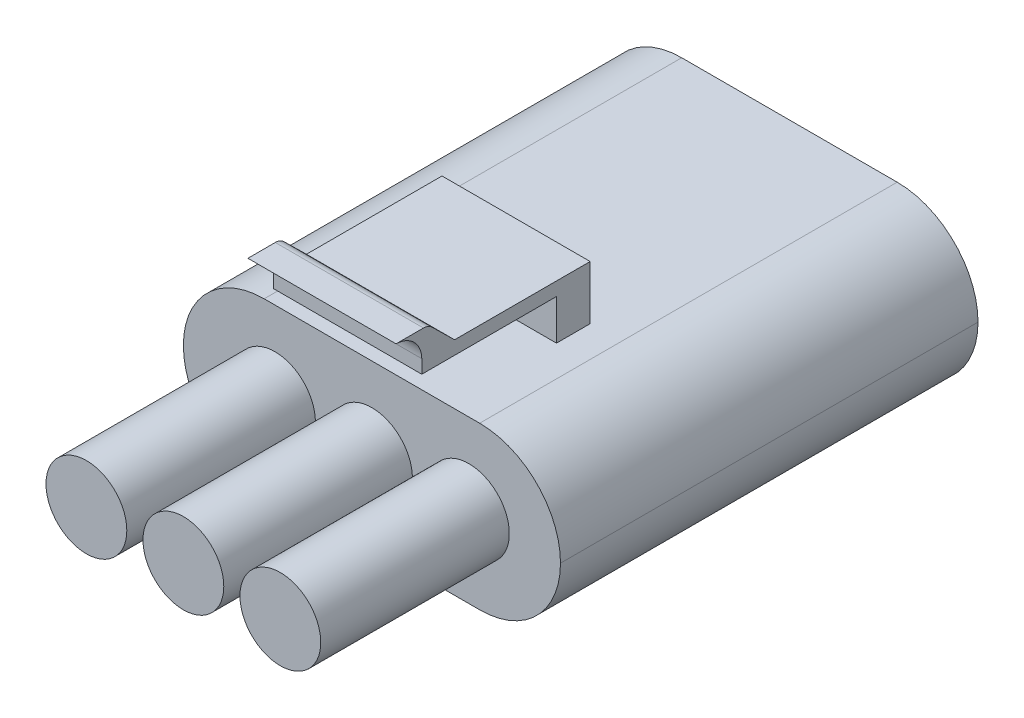
ISO-10303-21;
HEADER;
FILE_DESCRIPTION(('STEP AP214'),'2;1');
FILE_NAME('part.step','',(''),(''),'','','');
FILE_SCHEMA(('AUTOMOTIVE_DESIGN { 1 0 10303 214 1 1 1 1 }'));
ENDSEC;
DATA;
#1=APPLICATION_CONTEXT('core data for automotive mechanical design processes');
#2=APPLICATION_PROTOCOL_DEFINITION('international standard','automotive_design',2000,#1);
#3=PRODUCT_CONTEXT('',#1,'mechanical');
#4=PRODUCT('Part','Part','',(#3));
#5=PRODUCT_RELATED_PRODUCT_CATEGORY('part','',(#4));
#6=PRODUCT_DEFINITION_FORMATION('','',#4);
#7=PRODUCT_DEFINITION_CONTEXT('part definition',#1,'design');
#8=PRODUCT_DEFINITION('design','',#6,#7);
#9=PRODUCT_DEFINITION_SHAPE('','',#8);
#10=(LENGTH_UNIT() NAMED_UNIT(*) SI_UNIT(.MILLI.,.METRE.));
#11=(NAMED_UNIT(*) PLANE_ANGLE_UNIT() SI_UNIT($,.RADIAN.));
#12=(NAMED_UNIT(*) SI_UNIT($,.STERADIAN.) SOLID_ANGLE_UNIT());
#13=UNCERTAINTY_MEASURE_WITH_UNIT(LENGTH_MEASURE(1.E-05),#10,'distance_accuracy_value','');
#14=(GEOMETRIC_REPRESENTATION_CONTEXT(3) GLOBAL_UNCERTAINTY_ASSIGNED_CONTEXT((#13)) GLOBAL_UNIT_ASSIGNED_CONTEXT((#10,
#11,#12)) REPRESENTATION_CONTEXT('',''));
#15=CARTESIAN_POINT('',(0.,0.,0.));
#16=DIRECTION('',(0.,0.,1.));
#17=DIRECTION('',(1.,0.,0.));
#18=AXIS2_PLACEMENT_3D('',#15,#16,#17);
#19=CARTESIAN_POINT('',(0.,16.,0.));
#20=DIRECTION('',(0.,1.,0.));
#21=DIRECTION('',(0.,0.,1.));
#22=AXIS2_PLACEMENT_3D('',#19,#20,#21);
#23=PLANE('',#22);
#24=DIRECTION('',(0.,0.,1.));
#25=VECTOR('',#24,1.);
#26=CARTESIAN_POINT('',(8.70256652162755,16.,20.5));
#27=LINE('',#26,#25);
#28=CARTESIAN_POINT('',(8.70256652162755,16.,20.5));
#29=VERTEX_POINT('',#28);
#30=CARTESIAN_POINT('',(8.70256652162755,16.,30.5660328926047));
#31=VERTEX_POINT('',#30);
#32=EDGE_CURVE('E208',#29,#31,#27,.T.);
#33=ORIENTED_EDGE('',*,*,#32,.T.);
#34=DIRECTION('',(1.,0.,0.));
#35=VECTOR('',#34,1.);
#36=CARTESIAN_POINT('',(8.70256652162755,16.,30.5660328926047));
#37=LINE('',#36,#35);
#38=CARTESIAN_POINT('',(19.7025665216275,16.,30.5660328926047));
#39=VERTEX_POINT('',#38);
#40=EDGE_CURVE('E195',#31,#39,#37,.T.);
#41=ORIENTED_EDGE('',*,*,#40,.T.);
#42=DIRECTION('',(0.,0.,-1.));
#43=VECTOR('',#42,1.);
#44=CARTESIAN_POINT('',(19.7025665216275,16.,20.5));
#45=LINE('',#44,#43);
#46=CARTESIAN_POINT('',(19.7025665216275,16.,20.5));
#47=VERTEX_POINT('',#46);
#48=EDGE_CURVE('E200',#39,#47,#45,.T.);
#49=ORIENTED_EDGE('',*,*,#48,.T.);
#50=DIRECTION('',(-1.,0.,0.));
#51=VECTOR('',#50,1.);
#52=CARTESIAN_POINT('',(8.70256652162755,16.,20.5));
#53=LINE('',#52,#51);
#54=EDGE_CURVE('E213',#47,#29,#53,.T.);
#55=ORIENTED_EDGE('',*,*,#54,.T.);
#56=EDGE_LOOP('',(#33,#41,#49,#55));
#57=FACE_BOUND('',#56,.T.);
#58=ADVANCED_FACE('F36',(#57),#23,.T.);
#59=CARTESIAN_POINT('',(8.70256652162755,16.,23.));
#60=DIRECTION('',(0.,0.,-1.));
#61=DIRECTION('',(-1.,0.,0.));
#62=AXIS2_PLACEMENT_3D('',#59,#60,#61);
#63=PLANE('',#62);
#64=DIRECTION('',(1.,0.,0.));
#65=VECTOR('',#64,1.);
#66=CARTESIAN_POINT('',(8.70256652162755,15.,23.));
#67=LINE('',#66,#65);
#68=CARTESIAN_POINT('',(8.70256652162755,15.,23.));
#69=VERTEX_POINT('',#68);
#70=CARTESIAN_POINT('',(19.7025665216275,15.,23.));
#71=VERTEX_POINT('',#70);
#72=EDGE_CURVE('E194',#69,#71,#67,.T.);
#73=ORIENTED_EDGE('',*,*,#72,.F.);
#74=DIRECTION('',(0.,-1.,0.));
#75=VECTOR('',#74,1.);
#76=CARTESIAN_POINT('',(8.70256652162755,16.,23.));
#77=LINE('',#76,#75);
#78=CARTESIAN_POINT('',(8.70256652162755,12.,23.));
#79=VERTEX_POINT('',#78);
#80=EDGE_CURVE('E61',#69,#79,#77,.T.);
#81=ORIENTED_EDGE('',*,*,#80,.T.);
#82=DIRECTION('',(1.,0.,0.));
#83=VECTOR('',#82,1.);
#84=CARTESIAN_POINT('',(8.70256652162755,12.,23.));
#85=LINE('',#84,#83);
#86=CARTESIAN_POINT('',(19.7025665216275,12.,23.));
#87=VERTEX_POINT('',#86);
#88=EDGE_CURVE('E231',#79,#87,#85,.T.);
#89=ORIENTED_EDGE('',*,*,#88,.T.);
#90=DIRECTION('',(0.,-1.,0.));
#91=VECTOR('',#90,1.);
#92=CARTESIAN_POINT('',(19.7025665216275,16.,23.));
#93=LINE('',#92,#91);
#94=EDGE_CURVE('E239',#71,#87,#93,.T.);
#95=ORIENTED_EDGE('',*,*,#94,.F.);
#96=EDGE_LOOP('',(#73,#81,#89,#95));
#97=FACE_BOUND('',#96,.T.);
#98=ADVANCED_FACE('F348',(#97),#63,.F.);
#99=CARTESIAN_POINT('',(0.,12.,31.));
#100=DIRECTION('',(0.,-1.,0.));
#101=DIRECTION('',(0.,0.,-1.));
#102=AXIS2_PLACEMENT_3D('',#99,#100,#101);
#103=PLANE('',#102);
#104=DIRECTION('',(-1.,0.,0.));
#105=VECTOR('',#104,1.);
#106=CARTESIAN_POINT('',(0.,12.,31.));
#107=LINE('',#106,#105);
#108=CARTESIAN_POINT('',(22.,12.,31.));
#109=VERTEX_POINT('',#108);
#110=CARTESIAN_POINT('',(6.,12.,31.));
#111=VERTEX_POINT('',#110);
#112=EDGE_CURVE('E255',#109,#111,#107,.T.);
#113=ORIENTED_EDGE('',*,*,#112,.F.);
#114=DIRECTION('',(0.,0.,-1.));
#115=VECTOR('',#114,1.);
#116=CARTESIAN_POINT('',(22.,12.,31.));
#117=LINE('',#116,#115);
#118=CARTESIAN_POINT('',(22.,12.,0.));
#119=VERTEX_POINT('',#118);
#120=EDGE_CURVE('E289',#109,#119,#117,.T.);
#121=ORIENTED_EDGE('',*,*,#120,.T.);
#122=DIRECTION('',(-1.,0.,0.));
#123=VECTOR('',#122,1.);
#124=CARTESIAN_POINT('',(0.,12.,0.));
#125=LINE('',#124,#123);
#126=CARTESIAN_POINT('',(6.,12.,0.));
#127=VERTEX_POINT('',#126);
#128=EDGE_CURVE('E256',#119,#127,#125,.T.);
#129=ORIENTED_EDGE('',*,*,#128,.T.);
#130=DIRECTION('',(0.,0.,-1.));
#131=VECTOR('',#130,1.);
#132=CARTESIAN_POINT('',(6.,12.,31.));
#133=LINE('',#132,#131);
#134=EDGE_CURVE('E287',#127,#111,#133,.F.);
#135=ORIENTED_EDGE('',*,*,#134,.T.);
#136=EDGE_LOOP('',(#113,#121,#129,#135));
#137=FACE_BOUND('',#136,.T.);
#138=DIRECTION('',(0.,0.,1.));
#139=VECTOR('',#138,1.);
#140=CARTESIAN_POINT('',(8.70256652162755,12.,20.5));
#141=LINE('',#140,#139);
#142=CARTESIAN_POINT('',(8.70256652162755,12.,20.5));
#143=VERTEX_POINT('',#142);
#144=EDGE_CURVE('E229',#143,#79,#141,.T.);
#145=ORIENTED_EDGE('',*,*,#144,.F.);
#146=DIRECTION('',(-1.,0.,0.));
#147=VECTOR('',#146,1.);
#148=CARTESIAN_POINT('',(8.70256652162755,12.,20.5));
#149=LINE('',#148,#147);
#150=CARTESIAN_POINT('',(19.7025665216275,12.,20.5));
#151=VERTEX_POINT('',#150);
#152=EDGE_CURVE('E215',#151,#143,#149,.T.);
#153=ORIENTED_EDGE('',*,*,#152,.F.);
#154=DIRECTION('',(0.,0.,-1.));
#155=VECTOR('',#154,1.);
#156=CARTESIAN_POINT('',(19.7025665216275,12.,20.5));
#157=LINE('',#156,#155);
#158=EDGE_CURVE('E217',#87,#151,#157,.T.);
#159=ORIENTED_EDGE('',*,*,#158,.F.);
#160=ORIENTED_EDGE('',*,*,#88,.F.);
#161=EDGE_LOOP('',(#145,#153,#159,#160));
#162=FACE_BOUND('',#161,.T.);
#163=ADVANCED_FACE('F329',(#137,#162),#103,.F.);
#164=CARTESIAN_POINT('',(0.,0.,31.));
#165=DIRECTION('',(0.,1.,0.));
#166=DIRECTION('',(0.,0.,1.));
#167=AXIS2_PLACEMENT_3D('',#164,#165,#166);
#168=PLANE('',#167);
#169=DIRECTION('',(1.,0.,0.));
#170=VECTOR('',#169,1.);
#171=CARTESIAN_POINT('',(0.,0.,0.));
#172=LINE('',#171,#170);
#173=CARTESIAN_POINT('',(6.,0.,0.));
#174=VERTEX_POINT('',#173);
#175=CARTESIAN_POINT('',(22.,0.,0.));
#176=VERTEX_POINT('',#175);
#177=EDGE_CURVE('E260',#174,#176,#172,.T.);
#178=ORIENTED_EDGE('',*,*,#177,.T.);
#179=DIRECTION('',(0.,0.,-1.));
#180=VECTOR('',#179,1.);
#181=CARTESIAN_POINT('',(22.,0.,31.));
#182=LINE('',#181,#180);
#183=CARTESIAN_POINT('',(22.,0.,31.));
#184=VERTEX_POINT('',#183);
#185=EDGE_CURVE('E276',#176,#184,#182,.F.);
#186=ORIENTED_EDGE('',*,*,#185,.T.);
#187=DIRECTION('',(1.,0.,0.));
#188=VECTOR('',#187,1.);
#189=CARTESIAN_POINT('',(0.,0.,31.));
#190=LINE('',#189,#188);
#191=CARTESIAN_POINT('',(6.,0.,31.));
#192=VERTEX_POINT('',#191);
#193=EDGE_CURVE('E252',#192,#184,#190,.T.);
#194=ORIENTED_EDGE('',*,*,#193,.F.);
#195=DIRECTION('',(0.,0.,-1.));
#196=VECTOR('',#195,1.);
#197=CARTESIAN_POINT('',(6.,0.,31.));
#198=LINE('',#197,#196);
#199=EDGE_CURVE('E273',#192,#174,#198,.T.);
#200=ORIENTED_EDGE('',*,*,#199,.T.);
#201=EDGE_LOOP('',(#178,#186,#194,#200));
#202=FACE_BOUND('',#201,.T.);
#203=ADVANCED_FACE('F306',(#202),#168,.F.);
#204=CARTESIAN_POINT('',(0.,0.,31.));
#205=DIRECTION('',(0.,0.,-1.));
#206=DIRECTION('',(-1.,0.,0.));
#207=AXIS2_PLACEMENT_3D('',#204,#205,#206);
#208=PLANE('',#207);
#209=CARTESIAN_POINT('',(21.2005758644492,6.,31.));
#210=DIRECTION('',(0.,0.,-1.));
#211=DIRECTION('',(-1.,0.,0.));
#212=AXIS2_PLACEMENT_3D('',#209,#210,#211);
#213=CIRCLE('',#212,3.);
#214=CARTESIAN_POINT('',(18.2005758644492,6.,31.));
#215=VERTEX_POINT('',#214);
#216=EDGE_CURVE('E11',#215,#215,#213,.F.);
#217=ORIENTED_EDGE('',*,*,#216,.F.);
#218=EDGE_LOOP('',(#217));
#219=FACE_BOUND('',#218,.T.);
#220=CARTESIAN_POINT('',(6.79942413555083,6.,31.));
#221=DIRECTION('',(0.,0.,-1.));
#222=DIRECTION('',(-1.,0.,0.));
#223=AXIS2_PLACEMENT_3D('',#220,#221,#222);
#224=CIRCLE('',#223,3.);
#225=CARTESIAN_POINT('',(3.79942413555083,6.,31.));
#226=VERTEX_POINT('',#225);
#227=EDGE_CURVE('E45',#226,#226,#224,.F.);
#228=ORIENTED_EDGE('',*,*,#227,.F.);
#229=EDGE_LOOP('',(#228));
#230=FACE_BOUND('',#229,.T.);
#231=CARTESIAN_POINT('',(14.,6.,31.));
#232=DIRECTION('',(0.,0.,-1.));
#233=DIRECTION('',(-1.,0.,0.));
#234=AXIS2_PLACEMENT_3D('',#231,#232,#233);
#235=CIRCLE('',#234,3.);
#236=CARTESIAN_POINT('',(11.,6.,31.));
#237=VERTEX_POINT('',#236);
#238=EDGE_CURVE('E291',#237,#237,#235,.F.);
#239=ORIENTED_EDGE('',*,*,#238,.F.);
#240=EDGE_LOOP('',(#239));
#241=FACE_BOUND('',#240,.T.);
#242=ORIENTED_EDGE('',*,*,#193,.T.);
#243=CARTESIAN_POINT('',(22.,6.,31.));
#244=DIRECTION('',(0.,0.,-1.));
#245=DIRECTION('',(-1.,0.,0.));
#246=AXIS2_PLACEMENT_3D('',#243,#244,#245);
#247=CIRCLE('',#246,6.);
#248=CARTESIAN_POINT('',(28.,6.,31.));
#249=VERTEX_POINT('',#248);
#250=EDGE_CURVE('E285',#184,#249,#247,.F.);
#251=ORIENTED_EDGE('',*,*,#250,.T.);
#252=CARTESIAN_POINT('',(22.,6.,31.));
#253=DIRECTION('',(0.,0.,-1.));
#254=DIRECTION('',(-1.,0.,0.));
#255=AXIS2_PLACEMENT_3D('',#252,#253,#254);
#256=CIRCLE('',#255,6.);
#257=EDGE_CURVE('E283',#249,#109,#256,.F.);
#258=ORIENTED_EDGE('',*,*,#257,.T.);
#259=ORIENTED_EDGE('',*,*,#112,.T.);
#260=CARTESIAN_POINT('',(6.,6.,31.));
#261=DIRECTION('',(0.,0.,-1.));
#262=DIRECTION('',(-1.,0.,0.));
#263=AXIS2_PLACEMENT_3D('',#260,#261,#262);
#264=CIRCLE('',#263,6.);
#265=CARTESIAN_POINT('',(0.,6.,31.));
#266=VERTEX_POINT('',#265);
#267=EDGE_CURVE('E279',#111,#266,#264,.F.);
#268=ORIENTED_EDGE('',*,*,#267,.T.);
#269=CARTESIAN_POINT('',(6.,6.,31.));
#270=DIRECTION('',(0.,0.,-1.));
#271=DIRECTION('',(-1.,0.,0.));
#272=AXIS2_PLACEMENT_3D('',#269,#270,#271);
#273=CIRCLE('',#272,6.);
#274=EDGE_CURVE('E281',#266,#192,#273,.F.);
#275=ORIENTED_EDGE('',*,*,#274,.T.);
#276=EDGE_LOOP('',(#242,#251,#258,#259,#268,#275));
#277=FACE_BOUND('',#276,.T.);
#278=ADVANCED_FACE('F302',(#219,#230,#241,#277),#208,.F.);
#279=CARTESIAN_POINT('',(0.,0.,0.));
#280=DIRECTION('',(0.,0.,-1.));
#281=DIRECTION('',(-1.,0.,0.));
#282=AXIS2_PLACEMENT_3D('',#279,#280,#281);
#283=PLANE('',#282);
#284=CARTESIAN_POINT('',(14.,6.44727868470477,0.));
#285=DIRECTION('',(0.,0.,-1.));
#286=DIRECTION('',(-1.,0.,0.));
#287=AXIS2_PLACEMENT_3D('',#284,#285,#286);
#288=CIRCLE('',#287,4.98546899239036);
#289=CARTESIAN_POINT('',(9.01453100760963,6.44727868470477,0.));
#290=VERTEX_POINT('',#289);
#291=EDGE_CURVE('E184',#290,#290,#288,.T.);
#292=ORIENTED_EDGE('',*,*,#291,.F.);
#293=EDGE_LOOP('',(#292));
#294=FACE_BOUND('',#293,.T.);
#295=CARTESIAN_POINT('',(22.,6.,0.));
#296=DIRECTION('',(0.,0.,-1.));
#297=DIRECTION('',(-1.,0.,0.));
#298=AXIS2_PLACEMENT_3D('',#295,#296,#297);
#299=CIRCLE('',#298,6.);
#300=CARTESIAN_POINT('',(28.,6.,0.));
#301=VERTEX_POINT('',#300);
#302=EDGE_CURVE('E269',#119,#301,#299,.T.);
#303=ORIENTED_EDGE('',*,*,#302,.T.);
#304=CARTESIAN_POINT('',(22.,6.,0.));
#305=DIRECTION('',(0.,0.,-1.));
#306=DIRECTION('',(-1.,0.,0.));
#307=AXIS2_PLACEMENT_3D('',#304,#305,#306);
#308=CIRCLE('',#307,6.);
#309=EDGE_CURVE('E271',#301,#176,#308,.T.);
#310=ORIENTED_EDGE('',*,*,#309,.T.);
#311=ORIENTED_EDGE('',*,*,#177,.F.);
#312=CARTESIAN_POINT('',(6.,6.,0.));
#313=DIRECTION('',(0.,0.,-1.));
#314=DIRECTION('',(-1.,0.,0.));
#315=AXIS2_PLACEMENT_3D('',#312,#313,#314);
#316=CIRCLE('',#315,6.);
#317=CARTESIAN_POINT('',(0.,6.,0.));
#318=VERTEX_POINT('',#317);
#319=EDGE_CURVE('E267',#174,#318,#316,.T.);
#320=ORIENTED_EDGE('',*,*,#319,.T.);
#321=CARTESIAN_POINT('',(6.,6.,0.));
#322=DIRECTION('',(0.,0.,-1.));
#323=DIRECTION('',(-1.,0.,0.));
#324=AXIS2_PLACEMENT_3D('',#321,#322,#323);
#325=CIRCLE('',#324,6.);
#326=EDGE_CURVE('E259',#318,#127,#325,.T.);
#327=ORIENTED_EDGE('',*,*,#326,.T.);
#328=ORIENTED_EDGE('',*,*,#128,.F.);
#329=EDGE_LOOP('',(#303,#310,#311,#320,#327,#328));
#330=FACE_BOUND('',#329,.T.);
#331=ADVANCED_FACE('F305',(#294,#330),#283,.T.);
#332=CARTESIAN_POINT('',(22.,6.,31.));
#333=DIRECTION('',(0.,0.,-1.));
#334=DIRECTION('',(-1.,0.,0.));
#335=AXIS2_PLACEMENT_3D('',#332,#333,#334);
#336=CYLINDRICAL_SURFACE('',#335,6.);
#337=ORIENTED_EDGE('',*,*,#120,.F.);
#338=ORIENTED_EDGE('',*,*,#257,.F.);
#339=DIRECTION('',(0.,0.,-1.));
#340=VECTOR('',#339,1.);
#341=CARTESIAN_POINT('',(28.,6.,31.));
#342=LINE('',#341,#340);
#343=EDGE_CURVE('E263',#301,#249,#342,.F.);
#344=ORIENTED_EDGE('',*,*,#343,.F.);
#345=ORIENTED_EDGE('',*,*,#302,.F.);
#346=EDGE_LOOP('',(#337,#338,#344,#345));
#347=FACE_BOUND('',#346,.T.);
#348=ADVANCED_FACE('F334',(#347),#336,.T.);
#349=CARTESIAN_POINT('',(22.,6.,31.));
#350=DIRECTION('',(0.,0.,-1.));
#351=DIRECTION('',(-1.,0.,0.));
#352=AXIS2_PLACEMENT_3D('',#349,#350,#351);
#353=CYLINDRICAL_SURFACE('',#352,6.);
#354=ORIENTED_EDGE('',*,*,#250,.F.);
#355=ORIENTED_EDGE('',*,*,#185,.F.);
#356=ORIENTED_EDGE('',*,*,#309,.F.);
#357=ORIENTED_EDGE('',*,*,#343,.T.);
#358=EDGE_LOOP('',(#354,#355,#356,#357));
#359=FACE_BOUND('',#358,.T.);
#360=ADVANCED_FACE('F338',(#359),#353,.T.);
#361=CARTESIAN_POINT('',(6.,6.,31.));
#362=DIRECTION('',(0.,0.,-1.));
#363=DIRECTION('',(-1.,0.,0.));
#364=AXIS2_PLACEMENT_3D('',#361,#362,#363);
#365=CYLINDRICAL_SURFACE('',#364,6.);
#366=DIRECTION('',(0.,0.,-1.));
#367=VECTOR('',#366,1.);
#368=CARTESIAN_POINT('',(0.,6.,31.));
#369=LINE('',#368,#367);
#370=EDGE_CURVE('E251',#266,#318,#369,.T.);
#371=ORIENTED_EDGE('',*,*,#370,.F.);
#372=ORIENTED_EDGE('',*,*,#267,.F.);
#373=ORIENTED_EDGE('',*,*,#134,.F.);
#374=ORIENTED_EDGE('',*,*,#326,.F.);
#375=EDGE_LOOP('',(#371,#372,#373,#374));
#376=FACE_BOUND('',#375,.T.);
#377=ADVANCED_FACE('F38',(#376),#365,.T.);
#378=CARTESIAN_POINT('',(6.,6.,31.));
#379=DIRECTION('',(0.,0.,-1.));
#380=DIRECTION('',(-1.,0.,0.));
#381=AXIS2_PLACEMENT_3D('',#378,#379,#380);
#382=CYLINDRICAL_SURFACE('',#381,6.);
#383=ORIENTED_EDGE('',*,*,#274,.F.);
#384=ORIENTED_EDGE('',*,*,#370,.T.);
#385=ORIENTED_EDGE('',*,*,#319,.F.);
#386=ORIENTED_EDGE('',*,*,#199,.F.);
#387=EDGE_LOOP('',(#383,#384,#385,#386));
#388=FACE_BOUND('',#387,.T.);
#389=ADVANCED_FACE('F319',(#388),#382,.T.);
#390=CARTESIAN_POINT('',(14.,6.,45.));
#391=DIRECTION('',(0.,0.,-1.));
#392=DIRECTION('',(-1.,0.,0.));
#393=AXIS2_PLACEMENT_3D('',#390,#391,#392);
#394=CYLINDRICAL_SURFACE('',#393,3.);
#395=CARTESIAN_POINT('',(14.,6.,45.));
#396=DIRECTION('',(0.,0.,1.));
#397=DIRECTION('',(1.,0.,0.));
#398=AXIS2_PLACEMENT_3D('',#395,#396,#397);
#399=CIRCLE('',#398,3.);
#400=CARTESIAN_POINT('',(17.,6.,45.));
#401=VERTEX_POINT('',#400);
#402=EDGE_CURVE('E248',#401,#401,#399,.T.);
#403=ORIENTED_EDGE('',*,*,#402,.F.);
#404=EDGE_LOOP('',(#403));
#405=FACE_BOUND('',#404,.T.);
#406=ORIENTED_EDGE('',*,*,#238,.T.);
#407=EDGE_LOOP('',(#406));
#408=FACE_BOUND('',#407,.T.);
#409=ADVANCED_FACE('F386',(#405,#408),#394,.T.);
#410=CARTESIAN_POINT('',(14.,6.,45.));
#411=DIRECTION('',(0.,0.,1.));
#412=DIRECTION('',(1.,0.,0.));
#413=AXIS2_PLACEMENT_3D('',#410,#411,#412);
#414=PLANE('',#413);
#415=ORIENTED_EDGE('',*,*,#402,.T.);
#416=EDGE_LOOP('',(#415));
#417=FACE_BOUND('',#416,.T.);
#418=ADVANCED_FACE('F382',(#417),#414,.T.);
#419=CARTESIAN_POINT('',(6.79942413555083,6.,45.));
#420=DIRECTION('',(0.,0.,-1.));
#421=DIRECTION('',(-1.,0.,0.));
#422=AXIS2_PLACEMENT_3D('',#419,#420,#421);
#423=CYLINDRICAL_SURFACE('',#422,3.);
#424=CARTESIAN_POINT('',(6.79942413555083,6.,45.));
#425=DIRECTION('',(0.,0.,1.));
#426=DIRECTION('',(1.,0.,0.));
#427=AXIS2_PLACEMENT_3D('',#424,#425,#426);
#428=CIRCLE('',#427,3.);
#429=CARTESIAN_POINT('',(9.79942413555083,6.,45.));
#430=VERTEX_POINT('',#429);
#431=EDGE_CURVE('E245',#430,#430,#428,.T.);
#432=ORIENTED_EDGE('',*,*,#431,.F.);
#433=EDGE_LOOP('',(#432));
#434=FACE_BOUND('',#433,.T.);
#435=ORIENTED_EDGE('',*,*,#227,.T.);
#436=EDGE_LOOP('',(#435));
#437=FACE_BOUND('',#436,.T.);
#438=ADVANCED_FACE('F300',(#434,#437),#423,.T.);
#439=CARTESIAN_POINT('',(6.79942413555083,6.,45.));
#440=DIRECTION('',(0.,0.,1.));
#441=DIRECTION('',(1.,0.,0.));
#442=AXIS2_PLACEMENT_3D('',#439,#440,#441);
#443=PLANE('',#442);
#444=ORIENTED_EDGE('',*,*,#431,.T.);
#445=EDGE_LOOP('',(#444));
#446=FACE_BOUND('',#445,.T.);
#447=ADVANCED_FACE('F375',(#446),#443,.T.);
#448=CARTESIAN_POINT('',(21.2005758644492,6.,45.));
#449=DIRECTION('',(0.,0.,-1.));
#450=DIRECTION('',(-1.,0.,0.));
#451=AXIS2_PLACEMENT_3D('',#448,#449,#450);
#452=CYLINDRICAL_SURFACE('',#451,3.);
#453=CARTESIAN_POINT('',(21.2005758644492,6.,45.));
#454=DIRECTION('',(0.,0.,1.));
#455=DIRECTION('',(-1.,0.,0.));
#456=AXIS2_PLACEMENT_3D('',#453,#454,#455);
#457=CIRCLE('',#456,3.);
#458=CARTESIAN_POINT('',(18.2005758644492,6.,45.));
#459=VERTEX_POINT('',#458);
#460=EDGE_CURVE('E242',#459,#459,#457,.T.);
#461=ORIENTED_EDGE('',*,*,#460,.F.);
#462=EDGE_LOOP('',(#461));
#463=FACE_BOUND('',#462,.T.);
#464=ORIENTED_EDGE('',*,*,#216,.T.);
#465=EDGE_LOOP('',(#464));
#466=FACE_BOUND('',#465,.T.);
#467=ADVANCED_FACE('F371',(#463,#466),#452,.T.);
#468=CARTESIAN_POINT('',(21.2005758644492,6.,45.));
#469=DIRECTION('',(0.,0.,-1.));
#470=DIRECTION('',(-1.,0.,0.));
#471=AXIS2_PLACEMENT_3D('',#468,#469,#470);
#472=PLANE('',#471);
#473=ORIENTED_EDGE('',*,*,#460,.T.);
#474=EDGE_LOOP('',(#473));
#475=FACE_BOUND('',#474,.T.);
#476=ADVANCED_FACE('F368',(#475),#472,.F.);
#477=CARTESIAN_POINT('',(8.70256652162755,16.,20.5));
#478=DIRECTION('',(1.,0.,0.));
#479=DIRECTION('',(0.,0.,-1.));
#480=AXIS2_PLACEMENT_3D('',#477,#478,#479);
#481=PLANE('',#480);
#482=ORIENTED_EDGE('',*,*,#144,.T.);
#483=ORIENTED_EDGE('',*,*,#80,.F.);
#484=DIRECTION('',(0.,0.,-1.));
#485=VECTOR('',#484,1.);
#486=CARTESIAN_POINT('',(8.70256652162755,15.,33.));
#487=LINE('',#486,#485);
#488=CARTESIAN_POINT('',(8.70256652162755,15.,33.));
#489=VERTEX_POINT('',#488);
#490=EDGE_CURVE('E223',#489,#69,#487,.T.);
#491=ORIENTED_EDGE('',*,*,#490,.F.);
#492=DIRECTION('',(0.,-1.,0.));
#493=VECTOR('',#492,1.);
#494=CARTESIAN_POINT('',(8.70256652162755,16.,33.));
#495=LINE('',#494,#493);
#496=CARTESIAN_POINT('',(8.70256652162755,16.,33.));
#497=VERTEX_POINT('',#496);
#498=EDGE_CURVE('E609',#497,#489,#495,.T.);
#499=ORIENTED_EDGE('',*,*,#498,.F.);
#500=CARTESIAN_POINT('',(8.70256652162755,15.9555779866729,34.9572606794904));
#501=DIRECTION('',(1.,0.,0.));
#502=DIRECTION('',(0.,0.,-1.));
#503=AXIS2_PLACEMENT_3D('',#500,#501,#502);
#504=CIRCLE('',#503,1.95776471588069);
#505=CARTESIAN_POINT('',(8.70256652162755,17.9128386661633,34.9128386661633));
#506=VERTEX_POINT('',#505);
#507=EDGE_CURVE('E162',#497,#506,#504,.T.);
#508=ORIENTED_EDGE('',*,*,#507,.T.);
#509=DIRECTION('',(0.,0.,-1.));
#510=VECTOR('',#509,1.);
#511=CARTESIAN_POINT('',(8.70256652162755,17.9128386661633,0.));
#512=LINE('',#511,#510);
#513=CARTESIAN_POINT('',(8.70256652162755,17.9128386661633,32.8786673757987));
#514=VERTEX_POINT('',#513);
#515=EDGE_CURVE('E154',#506,#514,#512,.T.);
#516=ORIENTED_EDGE('',*,*,#515,.T.);
#517=CARTESIAN_POINT('',(8.70256652162755,17.0128386661633,32.8786673757987));
#518=DIRECTION('',(1.,0.,0.));
#519=DIRECTION('',(0.,0.,-1.));
#520=AXIS2_PLACEMENT_3D('',#517,#518,#519);
#521=CIRCLE('',#520,0.9);
#522=CARTESIAN_POINT('',(8.70256652162755,17.6543733623269,32.2474516966379));
#523=VERTEX_POINT('',#522);
#524=EDGE_CURVE('E159',#514,#523,#521,.F.);
#525=ORIENTED_EDGE('',*,*,#524,.T.);
#526=DIRECTION('',(0.,-0.70135075462302,-0.712816329070624));
#527=VECTOR('',#526,1.);
#528=CARTESIAN_POINT('',(8.70256652162755,-7.15129344633411,7.03626565577759));
#529=LINE('',#528,#527);
#530=EDGE_CURVE('E176',#523,#31,#529,.T.);
#531=ORIENTED_EDGE('',*,*,#530,.T.);
#532=ORIENTED_EDGE('',*,*,#32,.F.);
#533=DIRECTION('',(0.,-1.,0.));
#534=VECTOR('',#533,1.);
#535=CARTESIAN_POINT('',(8.70256652162755,16.,20.5));
#536=LINE('',#535,#534);
#537=EDGE_CURVE('E228',#29,#143,#536,.T.);
#538=ORIENTED_EDGE('',*,*,#537,.T.);
#539=EDGE_LOOP('',(#482,#483,#491,#499,#508,#516,#525,#531,#532,#538));
#540=FACE_BOUND('',#539,.T.);
#541=ADVANCED_FACE('F157',(#540),#481,.F.);
#542=CARTESIAN_POINT('',(19.7025665216275,16.,20.5));
#543=DIRECTION('',(-1.,0.,0.));
#544=DIRECTION('',(0.,0.,1.));
#545=AXIS2_PLACEMENT_3D('',#542,#543,#544);
#546=PLANE('',#545);
#547=ORIENTED_EDGE('',*,*,#158,.T.);
#548=DIRECTION('',(0.,-1.,0.));
#549=VECTOR('',#548,1.);
#550=CARTESIAN_POINT('',(19.7025665216275,16.,20.5));
#551=LINE('',#550,#549);
#552=EDGE_CURVE('E236',#47,#151,#551,.T.);
#553=ORIENTED_EDGE('',*,*,#552,.F.);
#554=ORIENTED_EDGE('',*,*,#48,.F.);
#555=DIRECTION('',(0.,-0.70135075462302,-0.712816329070624));
#556=VECTOR('',#555,1.);
#557=CARTESIAN_POINT('',(19.7025665216275,-7.15129344633411,7.03626565577759));
#558=LINE('',#557,#556);
#559=CARTESIAN_POINT('',(19.7025665216275,17.6543733623269,32.2474516966379));
#560=VERTEX_POINT('',#559);
#561=EDGE_CURVE('E53',#560,#39,#558,.T.);
#562=ORIENTED_EDGE('',*,*,#561,.F.);
#563=CARTESIAN_POINT('',(19.7025665216275,17.0128386661633,32.8786673757987));
#564=DIRECTION('',(1.,0.,0.));
#565=DIRECTION('',(0.,0.,-1.));
#566=AXIS2_PLACEMENT_3D('',#563,#564,#565);
#567=CIRCLE('',#566,0.9);
#568=CARTESIAN_POINT('',(19.7025665216275,17.9128386661633,32.8786673757987));
#569=VERTEX_POINT('',#568);
#570=EDGE_CURVE('E188',#569,#560,#567,.F.);
#571=ORIENTED_EDGE('',*,*,#570,.F.);
#572=DIRECTION('',(0.,0.,-1.));
#573=VECTOR('',#572,1.);
#574=CARTESIAN_POINT('',(19.7025665216275,17.9128386661633,0.));
#575=LINE('',#574,#573);
#576=CARTESIAN_POINT('',(19.7025665216275,17.9128386661633,34.9128386661633));
#577=VERTEX_POINT('',#576);
#578=EDGE_CURVE('E171',#577,#569,#575,.T.);
#579=ORIENTED_EDGE('',*,*,#578,.F.);
#580=CARTESIAN_POINT('',(19.7025665216275,15.9555779866729,34.9572606794904));
#581=DIRECTION('',(1.,0.,0.));
#582=DIRECTION('',(0.,0.,-1.));
#583=AXIS2_PLACEMENT_3D('',#580,#581,#582);
#584=CIRCLE('',#583,1.95776471588069);
#585=CARTESIAN_POINT('',(19.7025665216275,16.,33.));
#586=VERTEX_POINT('',#585);
#587=EDGE_CURVE('E181',#586,#577,#584,.T.);
#588=ORIENTED_EDGE('',*,*,#587,.F.);
#589=DIRECTION('',(0.,1.,0.));
#590=VECTOR('',#589,1.);
#591=CARTESIAN_POINT('',(19.7025665216275,16.,33.));
#592=LINE('',#591,#590);
#593=CARTESIAN_POINT('',(19.7025665216275,15.,33.));
#594=VERTEX_POINT('',#593);
#595=EDGE_CURVE('E606',#594,#586,#592,.T.);
#596=ORIENTED_EDGE('',*,*,#595,.F.);
#597=DIRECTION('',(0.,0.,-1.));
#598=VECTOR('',#597,1.);
#599=CARTESIAN_POINT('',(19.7025665216275,15.,33.));
#600=LINE('',#599,#598);
#601=EDGE_CURVE('E605',#594,#71,#600,.T.);
#602=ORIENTED_EDGE('',*,*,#601,.T.);
#603=ORIENTED_EDGE('',*,*,#94,.T.);
#604=EDGE_LOOP('',(#547,#553,#554,#562,#571,#579,#588,#596,#602,#603));
#605=FACE_BOUND('',#604,.T.);
#606=ADVANCED_FACE('F361',(#605),#546,.F.);
#607=CARTESIAN_POINT('',(8.70256652162755,16.,20.5));
#608=DIRECTION('',(0.,0.,1.));
#609=DIRECTION('',(1.,0.,0.));
#610=AXIS2_PLACEMENT_3D('',#607,#608,#609);
#611=PLANE('',#610);
#612=ORIENTED_EDGE('',*,*,#152,.T.);
#613=ORIENTED_EDGE('',*,*,#537,.F.);
#614=ORIENTED_EDGE('',*,*,#54,.F.);
#615=ORIENTED_EDGE('',*,*,#552,.T.);
#616=EDGE_LOOP('',(#612,#613,#614,#615));
#617=FACE_BOUND('',#616,.T.);
#618=ADVANCED_FACE('F358',(#617),#611,.F.);
#619=CARTESIAN_POINT('',(8.70256652162755,15.,33.));
#620=DIRECTION('',(0.,1.,0.));
#621=DIRECTION('',(0.,0.,1.));
#622=AXIS2_PLACEMENT_3D('',#619,#620,#621);
#623=PLANE('',#622);
#624=ORIENTED_EDGE('',*,*,#72,.T.);
#625=ORIENTED_EDGE('',*,*,#601,.F.);
#626=DIRECTION('',(1.,0.,0.));
#627=VECTOR('',#626,1.);
#628=CARTESIAN_POINT('',(8.70256652162755,15.,33.));
#629=LINE('',#628,#627);
#630=EDGE_CURVE('E612',#489,#594,#629,.T.);
#631=ORIENTED_EDGE('',*,*,#630,.F.);
#632=ORIENTED_EDGE('',*,*,#490,.T.);
#633=EDGE_LOOP('',(#624,#625,#631,#632));
#634=FACE_BOUND('',#633,.T.);
#635=ADVANCED_FACE('F356',(#634),#623,.F.);
#636=CARTESIAN_POINT('',(0.,0.,33.));
#637=DIRECTION('',(0.,0.,1.));
#638=DIRECTION('',(1.,0.,0.));
#639=AXIS2_PLACEMENT_3D('',#636,#637,#638);
#640=PLANE('',#639);
#641=ORIENTED_EDGE('',*,*,#498,.T.);
#642=ORIENTED_EDGE('',*,*,#630,.T.);
#643=ORIENTED_EDGE('',*,*,#595,.T.);
#644=DIRECTION('',(-1.,0.,0.));
#645=VECTOR('',#644,1.);
#646=CARTESIAN_POINT('',(8.70256652162755,16.,33.));
#647=LINE('',#646,#645);
#648=EDGE_CURVE('E596',#586,#497,#647,.T.);
#649=ORIENTED_EDGE('',*,*,#648,.T.);
#650=EDGE_LOOP('',(#641,#642,#643,#649));
#651=FACE_BOUND('',#650,.T.);
#652=ADVANCED_FACE('F479',(#651),#640,.T.);
#653=CARTESIAN_POINT('',(8.70256652162755,17.0128386661633,32.8786673757987));
#654=DIRECTION('',(1.,0.,0.));
#655=DIRECTION('',(0.,0.,-1.));
#656=AXIS2_PLACEMENT_3D('',#653,#654,#655);
#657=CYLINDRICAL_SURFACE('',#656,0.9);
#658=ORIENTED_EDGE('',*,*,#570,.T.);
#659=DIRECTION('',(1.,0.,0.));
#660=VECTOR('',#659,1.);
#661=CARTESIAN_POINT('',(8.70256652162755,17.6543733623269,32.2474516966379));
#662=LINE('',#661,#660);
#663=EDGE_CURVE('E179',#523,#560,#662,.T.);
#664=ORIENTED_EDGE('',*,*,#663,.F.);
#665=ORIENTED_EDGE('',*,*,#524,.F.);
#666=DIRECTION('',(1.,0.,0.));
#667=VECTOR('',#666,1.);
#668=CARTESIAN_POINT('',(8.70256652162755,17.9128386661633,32.8786673757987));
#669=LINE('',#668,#667);
#670=EDGE_CURVE('E168',#514,#569,#669,.T.);
#671=ORIENTED_EDGE('',*,*,#670,.T.);
#672=EDGE_LOOP('',(#658,#664,#665,#671));
#673=FACE_BOUND('',#672,.T.);
#674=ADVANCED_FACE('F178',(#673),#657,.T.);
#675=CARTESIAN_POINT('',(8.70256652162755,-7.15129344633411,7.03626565577759));
#676=DIRECTION('',(0.,-0.712816329070624,0.70135075462302));
#677=DIRECTION('',(0.,-0.70135075462302,-0.712816329070624));
#678=AXIS2_PLACEMENT_3D('',#675,#676,#677);
#679=PLANE('',#678);
#680=ORIENTED_EDGE('',*,*,#561,.T.);
#681=ORIENTED_EDGE('',*,*,#40,.F.);
#682=ORIENTED_EDGE('',*,*,#530,.F.);
#683=ORIENTED_EDGE('',*,*,#663,.T.);
#684=EDGE_LOOP('',(#680,#681,#682,#683));
#685=FACE_BOUND('',#684,.T.);
#686=ADVANCED_FACE('F209',(#685),#679,.F.);
#687=CARTESIAN_POINT('',(8.70256652162755,15.9555779866729,34.9572606794904));
#688=DIRECTION('',(1.,0.,0.));
#689=DIRECTION('',(0.,0.,-1.));
#690=AXIS2_PLACEMENT_3D('',#687,#688,#689);
#691=CYLINDRICAL_SURFACE('',#690,1.95776471588069);
#692=ORIENTED_EDGE('',*,*,#587,.T.);
#693=DIRECTION('',(1.,0.,0.));
#694=VECTOR('',#693,1.);
#695=CARTESIAN_POINT('',(8.70256652162755,17.9128386661633,34.9128386661633));
#696=LINE('',#695,#694);
#697=EDGE_CURVE('E175',#506,#577,#696,.T.);
#698=ORIENTED_EDGE('',*,*,#697,.F.);
#699=ORIENTED_EDGE('',*,*,#507,.F.);
#700=ORIENTED_EDGE('',*,*,#648,.F.);
#701=EDGE_LOOP('',(#692,#698,#699,#700));
#702=FACE_BOUND('',#701,.T.);
#703=ADVANCED_FACE('F497',(#702),#691,.F.);
#704=CARTESIAN_POINT('',(8.70256652162755,17.9128386661633,0.));
#705=DIRECTION('',(0.,-1.,0.));
#706=DIRECTION('',(0.,0.,-1.));
#707=AXIS2_PLACEMENT_3D('',#704,#705,#706);
#708=PLANE('',#707);
#709=ORIENTED_EDGE('',*,*,#578,.T.);
#710=ORIENTED_EDGE('',*,*,#670,.F.);
#711=ORIENTED_EDGE('',*,*,#515,.F.);
#712=ORIENTED_EDGE('',*,*,#697,.T.);
#713=EDGE_LOOP('',(#709,#710,#711,#712));
#714=FACE_BOUND('',#713,.T.);
#715=ADVANCED_FACE('F169',(#714),#708,.F.);
#716=CARTESIAN_POINT('',(14.,6.44727868470477,1.));
#717=DIRECTION('',(0.,0.,-1.));
#718=DIRECTION('',(-1.,0.,0.));
#719=AXIS2_PLACEMENT_3D('',#716,#717,#718);
#720=CYLINDRICAL_SURFACE('',#719,4.98546899239036);
#721=CARTESIAN_POINT('',(14.,6.44727868470477,1.));
#722=DIRECTION('',(0.,0.,-1.));
#723=DIRECTION('',(-1.,0.,0.));
#724=AXIS2_PLACEMENT_3D('',#721,#722,#723);
#725=CIRCLE('',#724,4.98546899239036);
#726=CARTESIAN_POINT('',(9.01453100760963,6.44727868470477,1.));
#727=VERTEX_POINT('',#726);
#728=EDGE_CURVE('E190',#727,#727,#725,.T.);
#729=ORIENTED_EDGE('',*,*,#728,.F.);
#730=EDGE_LOOP('',(#729));
#731=FACE_BOUND('',#730,.T.);
#732=ORIENTED_EDGE('',*,*,#291,.T.);
#733=EDGE_LOOP('',(#732));
#734=FACE_BOUND('',#733,.T.);
#735=ADVANCED_FACE('F510',(#731,#734),#720,.F.);
#736=CARTESIAN_POINT('',(14.,6.44727868470477,1.));
#737=DIRECTION('',(0.,0.,-1.));
#738=DIRECTION('',(-1.,0.,0.));
#739=AXIS2_PLACEMENT_3D('',#736,#737,#738);
#740=PLANE('',#739);
#741=ORIENTED_EDGE('',*,*,#728,.T.);
#742=EDGE_LOOP('',(#741));
#743=FACE_BOUND('',#742,.T.);
#744=ADVANCED_FACE('F516',(#743),#740,.T.);
#745=CLOSED_SHELL('',(#58,#98,#163,#203,#278,#331,#348,#360,#377,#389,#409,#418,#438,#447,#467,
#476,#541,#606,#618,#635,#652,#674,#686,#703,#715,#735,#744));
#746=MANIFOLD_SOLID_BREP('B2',#745);
#747=ADVANCED_BREP_SHAPE_REPRESENTATION('',(#18,#746),#14);
#748=SHAPE_DEFINITION_REPRESENTATION(#9,#747);
ENDSEC;
END-ISO-10303-21;
